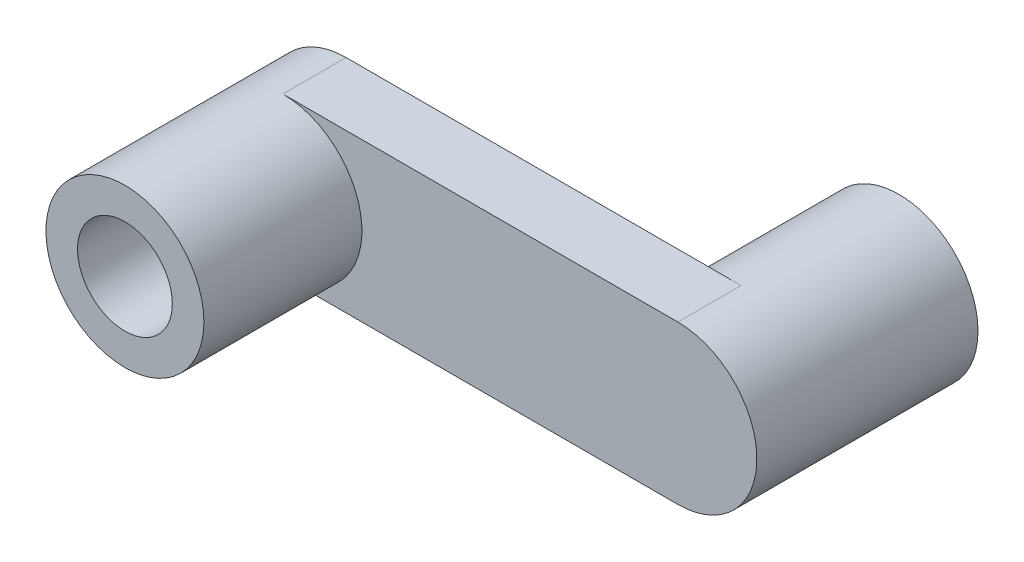
ISO-10303-21;
HEADER;
FILE_DESCRIPTION(('STEP AP214'),'2;1');
FILE_NAME('part.step','',(''),(''),'','','');
FILE_SCHEMA(('AUTOMOTIVE_DESIGN { 1 0 10303 214 1 1 1 1 }'));
ENDSEC;
DATA;
#1=APPLICATION_CONTEXT('core data for automotive mechanical design processes');
#2=APPLICATION_PROTOCOL_DEFINITION('international standard','automotive_design',2000,#1);
#3=PRODUCT_CONTEXT('',#1,'mechanical');
#4=PRODUCT('Part','Part','',(#3));
#5=PRODUCT_RELATED_PRODUCT_CATEGORY('part','',(#4));
#6=PRODUCT_DEFINITION_FORMATION('','',#4);
#7=PRODUCT_DEFINITION_CONTEXT('part definition',#1,'design');
#8=PRODUCT_DEFINITION('design','',#6,#7);
#9=PRODUCT_DEFINITION_SHAPE('','',#8);
#10=(LENGTH_UNIT() NAMED_UNIT(*) SI_UNIT(.MILLI.,.METRE.));
#11=(NAMED_UNIT(*) PLANE_ANGLE_UNIT() SI_UNIT($,.RADIAN.));
#12=(NAMED_UNIT(*) SI_UNIT($,.STERADIAN.) SOLID_ANGLE_UNIT());
#13=UNCERTAINTY_MEASURE_WITH_UNIT(LENGTH_MEASURE(1.E-05),#10,'distance_accuracy_value','');
#14=(GEOMETRIC_REPRESENTATION_CONTEXT(3) GLOBAL_UNCERTAINTY_ASSIGNED_CONTEXT((#13)) GLOBAL_UNIT_ASSIGNED_CONTEXT((#10,
#11,#12)) REPRESENTATION_CONTEXT('',''));
#15=CARTESIAN_POINT('',(0.,0.,0.));
#16=DIRECTION('',(0.,0.,1.));
#17=DIRECTION('',(1.,0.,0.));
#18=AXIS2_PLACEMENT_3D('',#15,#16,#17);
#19=CARTESIAN_POINT('',(-17.0545454545455,0.,2.));
#20=DIRECTION('',(0.,0.,-1.));
#21=DIRECTION('',(-1.,0.,0.));
#22=AXIS2_PLACEMENT_3D('',#19,#20,#21);
#23=CYLINDRICAL_SURFACE('',#22,5.);
#24=CARTESIAN_POINT('',(-17.0545454545455,0.,-2.));
#25=DIRECTION('',(0.,0.,1.));
#26=DIRECTION('',(1.,0.,0.));
#27=AXIS2_PLACEMENT_3D('',#24,#25,#26);
#28=CIRCLE('',#27,5.);
#29=CARTESIAN_POINT('',(-17.0545454545455,5.,-2.));
#30=VERTEX_POINT('',#29);
#31=CARTESIAN_POINT('',(-17.0545454545455,-5.,-2.));
#32=VERTEX_POINT('',#31);
#33=EDGE_CURVE('E87',#30,#32,#28,.T.);
#34=ORIENTED_EDGE('',*,*,#33,.T.);
#35=DIRECTION('',(0.,0.,-1.));
#36=VECTOR('',#35,1.);
#37=CARTESIAN_POINT('',(-17.0545454545455,-5.,2.));
#38=LINE('',#37,#36);
#39=CARTESIAN_POINT('',(-17.0545454545455,-5.,2.));
#40=VERTEX_POINT('',#39);
#41=EDGE_CURVE('E42',#40,#32,#38,.T.);
#42=ORIENTED_EDGE('',*,*,#41,.F.);
#43=CARTESIAN_POINT('',(-17.0545454545455,0.,2.));
#44=DIRECTION('',(0.,0.,1.));
#45=DIRECTION('',(1.,0.,0.));
#46=AXIS2_PLACEMENT_3D('',#43,#44,#45);
#47=CIRCLE('',#46,5.);
#48=CARTESIAN_POINT('',(-17.0545454545455,5.,2.));
#49=VERTEX_POINT('',#48);
#50=EDGE_CURVE('E49',#40,#49,#47,.T.);
#51=ORIENTED_EDGE('',*,*,#50,.T.);
#52=DIRECTION('',(0.,0.,-1.));
#53=VECTOR('',#52,1.);
#54=CARTESIAN_POINT('',(-17.0545454545455,5.,2.));
#55=LINE('',#54,#53);
#56=EDGE_CURVE('E99',#49,#30,#55,.T.);
#57=ORIENTED_EDGE('',*,*,#56,.T.);
#58=EDGE_LOOP('',(#34,#42,#51,#57));
#59=FACE_BOUND('',#58,.T.);
#60=CARTESIAN_POINT('',(-17.0545454545455,0.,12.));
#61=DIRECTION('',(0.,0.,1.));
#62=DIRECTION('',(1.,0.,0.));
#63=AXIS2_PLACEMENT_3D('',#60,#61,#62);
#64=CIRCLE('',#63,5.);
#65=CARTESIAN_POINT('',(-12.0545454545455,0.,12.));
#66=VERTEX_POINT('',#65);
#67=EDGE_CURVE('E116',#66,#66,#64,.T.);
#68=ORIENTED_EDGE('',*,*,#67,.F.);
#69=EDGE_LOOP('',(#68));
#70=FACE_BOUND('',#69,.T.);
#71=ADVANCED_FACE('F39',(#59,#70),#23,.T.);
#72=CARTESIAN_POINT('',(-17.0545454545455,-5.,2.));
#73=DIRECTION('',(0.,1.,0.));
#74=DIRECTION('',(0.,0.,1.));
#75=AXIS2_PLACEMENT_3D('',#72,#73,#74);
#76=PLANE('',#75);
#77=DIRECTION('',(1.,0.,0.));
#78=VECTOR('',#77,1.);
#79=CARTESIAN_POINT('',(-17.0545454545455,-5.,-2.));
#80=LINE('',#79,#78);
#81=CARTESIAN_POINT('',(7.94545454545454,-5.,-2.));
#82=VERTEX_POINT('',#81);
#83=EDGE_CURVE('E90',#32,#82,#80,.T.);
#84=ORIENTED_EDGE('',*,*,#83,.T.);
#85=DIRECTION('',(0.,0.,-1.));
#86=VECTOR('',#85,1.);
#87=CARTESIAN_POINT('',(7.94545454545454,-5.,2.));
#88=LINE('',#87,#86);
#89=CARTESIAN_POINT('',(7.94545454545454,-5.,2.));
#90=VERTEX_POINT('',#89);
#91=EDGE_CURVE('E98',#90,#82,#88,.T.);
#92=ORIENTED_EDGE('',*,*,#91,.F.);
#93=DIRECTION('',(1.,0.,0.));
#94=VECTOR('',#93,1.);
#95=CARTESIAN_POINT('',(-17.0545454545455,-5.,2.));
#96=LINE('',#95,#94);
#97=EDGE_CURVE('E89',#40,#90,#96,.T.);
#98=ORIENTED_EDGE('',*,*,#97,.F.);
#99=ORIENTED_EDGE('',*,*,#41,.T.);
#100=EDGE_LOOP('',(#84,#92,#98,#99));
#101=FACE_BOUND('',#100,.T.);
#102=ADVANCED_FACE('F169',(#101),#76,.F.);
#103=CARTESIAN_POINT('',(7.94545454545454,0.,2.));
#104=DIRECTION('',(0.,0.,-1.));
#105=DIRECTION('',(-1.,0.,0.));
#106=AXIS2_PLACEMENT_3D('',#103,#104,#105);
#107=CYLINDRICAL_SURFACE('',#106,5.);
#108=ORIENTED_EDGE('',*,*,#91,.T.);
#109=CARTESIAN_POINT('',(7.94545454545454,0.,-2.));
#110=DIRECTION('',(0.,0.,-1.));
#111=DIRECTION('',(-1.,0.,0.));
#112=AXIS2_PLACEMENT_3D('',#109,#110,#111);
#113=CIRCLE('',#112,5.);
#114=CARTESIAN_POINT('',(7.94545454545454,5.,-2.));
#115=VERTEX_POINT('',#114);
#116=EDGE_CURVE('E11',#82,#115,#113,.T.);
#117=ORIENTED_EDGE('',*,*,#116,.T.);
#118=DIRECTION('',(0.,0.,-1.));
#119=VECTOR('',#118,1.);
#120=CARTESIAN_POINT('',(7.94545454545454,5.,2.));
#121=LINE('',#120,#119);
#122=CARTESIAN_POINT('',(7.94545454545454,5.,2.));
#123=VERTEX_POINT('',#122);
#124=EDGE_CURVE('E93',#123,#115,#121,.T.);
#125=ORIENTED_EDGE('',*,*,#124,.F.);
#126=CARTESIAN_POINT('',(7.94545454545454,0.,2.));
#127=DIRECTION('',(0.,0.,1.));
#128=DIRECTION('',(1.,0.,0.));
#129=AXIS2_PLACEMENT_3D('',#126,#127,#128);
#130=CIRCLE('',#129,5.);
#131=EDGE_CURVE('E58',#90,#123,#130,.T.);
#132=ORIENTED_EDGE('',*,*,#131,.F.);
#133=EDGE_LOOP('',(#108,#117,#125,#132));
#134=FACE_BOUND('',#133,.T.);
#135=CARTESIAN_POINT('',(7.94545454545454,0.,-12.));
#136=DIRECTION('',(0.,0.,-1.));
#137=DIRECTION('',(-1.,0.,0.));
#138=AXIS2_PLACEMENT_3D('',#135,#136,#137);
#139=CIRCLE('',#138,5.);
#140=CARTESIAN_POINT('',(2.94545454545454,0.,-12.));
#141=VERTEX_POINT('',#140);
#142=EDGE_CURVE('E133',#141,#141,#139,.T.);
#143=ORIENTED_EDGE('',*,*,#142,.F.);
#144=EDGE_LOOP('',(#143));
#145=FACE_BOUND('',#144,.T.);
#146=ADVANCED_FACE('F102',(#134,#145),#107,.T.);
#147=CARTESIAN_POINT('',(-17.0545454545455,5.,2.));
#148=DIRECTION('',(0.,-1.,0.));
#149=DIRECTION('',(0.,0.,-1.));
#150=AXIS2_PLACEMENT_3D('',#147,#148,#149);
#151=PLANE('',#150);
#152=DIRECTION('',(-1.,0.,0.));
#153=VECTOR('',#152,1.);
#154=CARTESIAN_POINT('',(-17.0545454545455,5.,-2.));
#155=LINE('',#154,#153);
#156=EDGE_CURVE('E76',#115,#30,#155,.T.);
#157=ORIENTED_EDGE('',*,*,#156,.T.);
#158=ORIENTED_EDGE('',*,*,#56,.F.);
#159=DIRECTION('',(-1.,0.,0.));
#160=VECTOR('',#159,1.);
#161=CARTESIAN_POINT('',(-17.0545454545455,5.,2.));
#162=LINE('',#161,#160);
#163=EDGE_CURVE('E95',#123,#49,#162,.T.);
#164=ORIENTED_EDGE('',*,*,#163,.F.);
#165=ORIENTED_EDGE('',*,*,#124,.T.);
#166=EDGE_LOOP('',(#157,#158,#164,#165));
#167=FACE_BOUND('',#166,.T.);
#168=ADVANCED_FACE('F94',(#167),#151,.F.);
#169=CARTESIAN_POINT('',(-17.0545454545455,0.,2.));
#170=DIRECTION('',(0.,0.,1.));
#171=DIRECTION('',(1.,0.,0.));
#172=AXIS2_PLACEMENT_3D('',#169,#170,#171);
#173=PLANE('',#172);
#174=ORIENTED_EDGE('',*,*,#50,.F.);
#175=ORIENTED_EDGE('',*,*,#97,.T.);
#176=ORIENTED_EDGE('',*,*,#131,.T.);
#177=ORIENTED_EDGE('',*,*,#163,.T.);
#178=EDGE_LOOP('',(#174,#175,#176,#177));
#179=FACE_BOUND('',#178,.T.);
#180=ADVANCED_FACE('F166',(#179),#173,.T.);
#181=CARTESIAN_POINT('',(-17.0545454545455,0.,-2.));
#182=DIRECTION('',(0.,0.,1.));
#183=DIRECTION('',(1.,0.,0.));
#184=AXIS2_PLACEMENT_3D('',#181,#182,#183);
#185=PLANE('',#184);
#186=ORIENTED_EDGE('',*,*,#116,.F.);
#187=ORIENTED_EDGE('',*,*,#83,.F.);
#188=ORIENTED_EDGE('',*,*,#33,.F.);
#189=ORIENTED_EDGE('',*,*,#156,.F.);
#190=EDGE_LOOP('',(#186,#187,#188,#189));
#191=FACE_BOUND('',#190,.T.);
#192=ADVANCED_FACE('F85',(#191),#185,.F.);
#193=CARTESIAN_POINT('',(-17.0545454545455,0.,12.));
#194=DIRECTION('',(0.,0.,1.));
#195=DIRECTION('',(1.,0.,0.));
#196=AXIS2_PLACEMENT_3D('',#193,#194,#195);
#197=PLANE('',#196);
#198=ORIENTED_EDGE('',*,*,#67,.T.);
#199=EDGE_LOOP('',(#198));
#200=FACE_BOUND('',#199,.T.);
#201=CARTESIAN_POINT('',(-17.0545454545455,0.,12.));
#202=DIRECTION('',(0.,0.,1.));
#203=DIRECTION('',(1.,0.,0.));
#204=AXIS2_PLACEMENT_3D('',#201,#202,#203);
#205=CIRCLE('',#204,3.);
#206=CARTESIAN_POINT('',(-14.0545454545455,0.,12.));
#207=VERTEX_POINT('',#206);
#208=EDGE_CURVE('E128',#207,#207,#205,.T.);
#209=ORIENTED_EDGE('',*,*,#208,.F.);
#210=EDGE_LOOP('',(#209));
#211=FACE_BOUND('',#210,.T.);
#212=ADVANCED_FACE('F178',(#200,#211),#197,.T.);
#213=CARTESIAN_POINT('',(-17.0545454545455,0.,12.));
#214=DIRECTION('',(0.,0.,-1.));
#215=DIRECTION('',(-1.,0.,0.));
#216=AXIS2_PLACEMENT_3D('',#213,#214,#215);
#217=CYLINDRICAL_SURFACE('',#216,3.);
#218=ORIENTED_EDGE('',*,*,#208,.T.);
#219=EDGE_LOOP('',(#218));
#220=FACE_BOUND('',#219,.T.);
#221=CARTESIAN_POINT('',(-17.0545454545455,0.,2.));
#222=DIRECTION('',(0.,0.,1.));
#223=DIRECTION('',(1.,0.,0.));
#224=AXIS2_PLACEMENT_3D('',#221,#222,#223);
#225=CIRCLE('',#224,3.);
#226=CARTESIAN_POINT('',(-14.0545454545455,0.,2.));
#227=VERTEX_POINT('',#226);
#228=EDGE_CURVE('E129',#227,#227,#225,.T.);
#229=ORIENTED_EDGE('',*,*,#228,.F.);
#230=EDGE_LOOP('',(#229));
#231=FACE_BOUND('',#230,.T.);
#232=ADVANCED_FACE('F163',(#220,#231),#217,.F.);
#233=ORIENTED_EDGE('',*,*,#228,.T.);
#234=EDGE_LOOP('',(#233));
#235=FACE_BOUND('',#234,.T.);
#236=ADVANCED_FACE('F154',(#235),#173,.T.);
#237=CARTESIAN_POINT('',(7.94545454545454,0.,-12.));
#238=DIRECTION('',(0.,0.,-1.));
#239=DIRECTION('',(-1.,0.,0.));
#240=AXIS2_PLACEMENT_3D('',#237,#238,#239);
#241=PLANE('',#240);
#242=ORIENTED_EDGE('',*,*,#142,.T.);
#243=EDGE_LOOP('',(#242));
#244=FACE_BOUND('',#243,.T.);
#245=CARTESIAN_POINT('',(7.94545454545454,0.,-12.));
#246=DIRECTION('',(0.,0.,-1.));
#247=DIRECTION('',(-1.,0.,0.));
#248=AXIS2_PLACEMENT_3D('',#245,#246,#247);
#249=CIRCLE('',#248,3.);
#250=CARTESIAN_POINT('',(4.94545454545454,0.,-12.));
#251=VERTEX_POINT('',#250);
#252=EDGE_CURVE('E140',#251,#251,#249,.T.);
#253=ORIENTED_EDGE('',*,*,#252,.F.);
#254=EDGE_LOOP('',(#253));
#255=FACE_BOUND('',#254,.T.);
#256=ADVANCED_FACE('F152',(#244,#255),#241,.T.);
#257=CARTESIAN_POINT('',(7.94545454545454,0.,-12.));
#258=DIRECTION('',(0.,0.,1.));
#259=DIRECTION('',(1.,0.,0.));
#260=AXIS2_PLACEMENT_3D('',#257,#258,#259);
#261=CYLINDRICAL_SURFACE('',#260,3.);
#262=ORIENTED_EDGE('',*,*,#252,.T.);
#263=EDGE_LOOP('',(#262));
#264=FACE_BOUND('',#263,.T.);
#265=CARTESIAN_POINT('',(7.94545454545454,0.,-2.));
#266=DIRECTION('',(0.,0.,-1.));
#267=DIRECTION('',(-1.,0.,0.));
#268=AXIS2_PLACEMENT_3D('',#265,#266,#267);
#269=CIRCLE('',#268,3.);
#270=CARTESIAN_POINT('',(4.94545454545454,0.,-2.));
#271=VERTEX_POINT('',#270);
#272=EDGE_CURVE('E141',#271,#271,#269,.T.);
#273=ORIENTED_EDGE('',*,*,#272,.F.);
#274=EDGE_LOOP('',(#273));
#275=FACE_BOUND('',#274,.T.);
#276=ADVANCED_FACE('F149',(#264,#275),#261,.F.);
#277=ORIENTED_EDGE('',*,*,#272,.T.);
#278=EDGE_LOOP('',(#277));
#279=FACE_BOUND('',#278,.T.);
#280=ADVANCED_FACE('F161',(#279),#185,.F.);
#281=CLOSED_SHELL('',(#71,#102,#146,#168,#180,#192,#212,#232,#236,#256,#276,#280));
#282=MANIFOLD_SOLID_BREP('B2',#281);
#283=ADVANCED_BREP_SHAPE_REPRESENTATION('',(#18,#282),#14);
#284=SHAPE_DEFINITION_REPRESENTATION(#9,#283);
ENDSEC;
END-ISO-10303-21;
